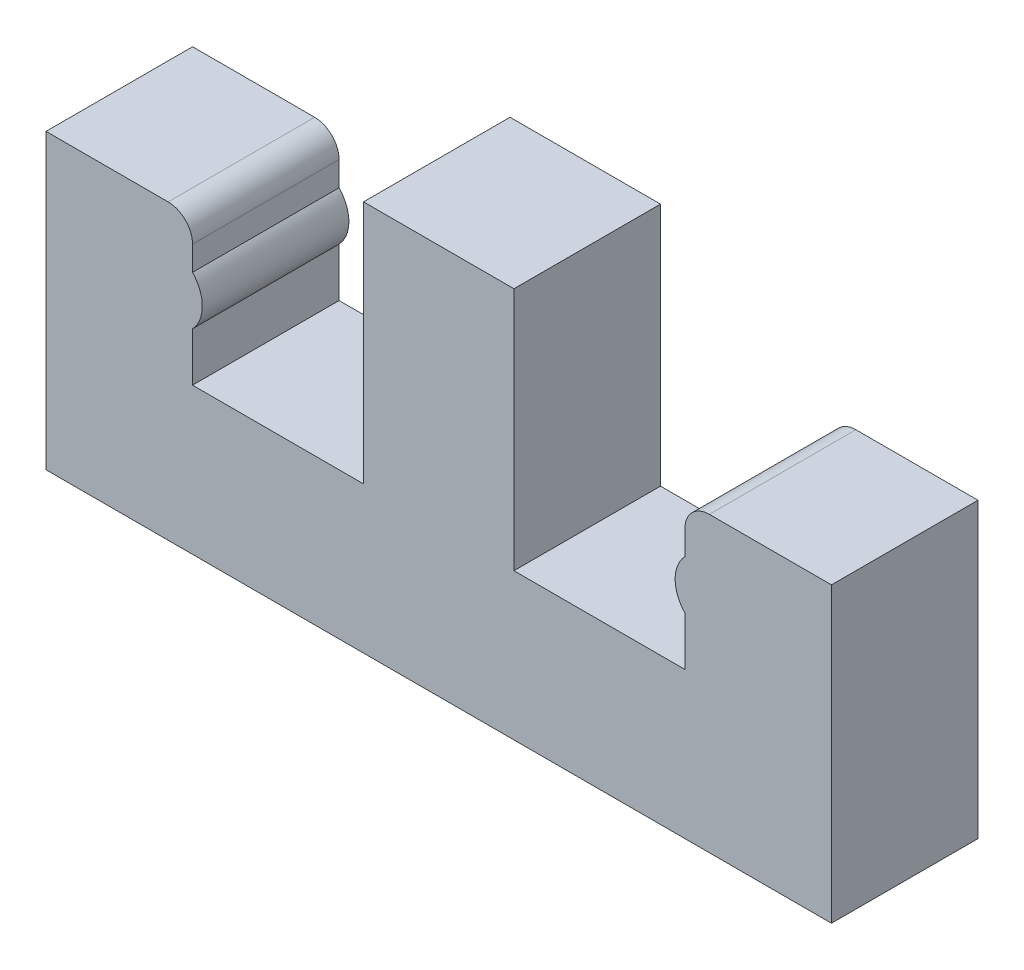
ISO-10303-21;
HEADER;
FILE_DESCRIPTION(('STEP AP214'),'2;1');
FILE_NAME('part.step','',(''),(''),'','','');
FILE_SCHEMA(('AUTOMOTIVE_DESIGN { 1 0 10303 214 1 1 1 1 }'));
ENDSEC;
DATA;
#1=APPLICATION_CONTEXT('core data for automotive mechanical design processes');
#2=APPLICATION_PROTOCOL_DEFINITION('international standard','automotive_design',2000,#1);
#3=PRODUCT_CONTEXT('',#1,'mechanical');
#4=PRODUCT('Part','Part','',(#3));
#5=PRODUCT_RELATED_PRODUCT_CATEGORY('part','',(#4));
#6=PRODUCT_DEFINITION_FORMATION('','',#4);
#7=PRODUCT_DEFINITION_CONTEXT('part definition',#1,'design');
#8=PRODUCT_DEFINITION('design','',#6,#7);
#9=PRODUCT_DEFINITION_SHAPE('','',#8);
#10=(LENGTH_UNIT() NAMED_UNIT(*) SI_UNIT(.MILLI.,.METRE.));
#11=(NAMED_UNIT(*) PLANE_ANGLE_UNIT() SI_UNIT($,.RADIAN.));
#12=(NAMED_UNIT(*) SI_UNIT($,.STERADIAN.) SOLID_ANGLE_UNIT());
#13=UNCERTAINTY_MEASURE_WITH_UNIT(LENGTH_MEASURE(1.E-05),#10,'distance_accuracy_value','');
#14=(GEOMETRIC_REPRESENTATION_CONTEXT(3) GLOBAL_UNCERTAINTY_ASSIGNED_CONTEXT((#13)) GLOBAL_UNIT_ASSIGNED_CONTEXT((#10,
#11,#12)) REPRESENTATION_CONTEXT('',''));
#15=CARTESIAN_POINT('',(0.,0.,0.));
#16=DIRECTION('',(0.,0.,1.));
#17=DIRECTION('',(1.,0.,0.));
#18=AXIS2_PLACEMENT_3D('',#15,#16,#17);
#19=CARTESIAN_POINT('',(-5.35043500893579,-2.26924572983576,3.));
#20=DIRECTION('',(1.,0.,0.));
#21=DIRECTION('',(0.,0.,-1.));
#22=AXIS2_PLACEMENT_3D('',#19,#20,#21);
#23=PLANE('',#22);
#24=DIRECTION('',(0.,-1.,0.));
#25=VECTOR('',#24,1.);
#26=CARTESIAN_POINT('',(-5.35043500893579,-2.26924572983576,0.));
#27=LINE('',#26,#25);
#28=CARTESIAN_POINT('',(-5.35043500893579,3.73075427016424,0.));
#29=VERTEX_POINT('',#28);
#30=CARTESIAN_POINT('',(-5.35043500893579,-2.26924572983576,0.));
#31=VERTEX_POINT('',#30);
#32=EDGE_CURVE('E181',#29,#31,#27,.T.);
#33=ORIENTED_EDGE('',*,*,#32,.T.);
#34=DIRECTION('',(0.,0.,-1.));
#35=VECTOR('',#34,1.);
#36=CARTESIAN_POINT('',(-5.35043500893579,-2.26924572983576,3.));
#37=LINE('',#36,#35);
#38=CARTESIAN_POINT('',(-5.35043500893579,-2.26924572983576,3.));
#39=VERTEX_POINT('',#38);
#40=EDGE_CURVE('E162',#39,#31,#37,.T.);
#41=ORIENTED_EDGE('',*,*,#40,.F.);
#42=DIRECTION('',(0.,-1.,0.));
#43=VECTOR('',#42,1.);
#44=CARTESIAN_POINT('',(-5.35043500893579,-2.26924572983576,3.));
#45=LINE('',#44,#43);
#46=CARTESIAN_POINT('',(-5.35043500893579,3.73075427016424,3.));
#47=VERTEX_POINT('',#46);
#48=EDGE_CURVE('E168',#47,#39,#45,.T.);
#49=ORIENTED_EDGE('',*,*,#48,.F.);
#50=DIRECTION('',(0.,0.,-1.));
#51=VECTOR('',#50,1.);
#52=CARTESIAN_POINT('',(-5.35043500893579,3.73075427016424,3.));
#53=LINE('',#52,#51);
#54=EDGE_CURVE('E242',#47,#29,#53,.T.);
#55=ORIENTED_EDGE('',*,*,#54,.T.);
#56=EDGE_LOOP('',(#33,#41,#49,#55));
#57=FACE_BOUND('',#56,.T.);
#58=ADVANCED_FACE('F33',(#57),#23,.F.);
#59=CARTESIAN_POINT('',(-5.35043500893579,-2.26924572983576,3.));
#60=DIRECTION('',(0.,1.,0.));
#61=DIRECTION('',(0.,0.,1.));
#62=AXIS2_PLACEMENT_3D('',#59,#60,#61);
#63=PLANE('',#62);
#64=DIRECTION('',(1.,0.,0.));
#65=VECTOR('',#64,1.);
#66=CARTESIAN_POINT('',(-5.35043500893579,-2.26924572983576,0.));
#67=LINE('',#66,#65);
#68=CARTESIAN_POINT('',(10.7295649910642,-2.26924572983576,0.));
#69=VERTEX_POINT('',#68);
#70=EDGE_CURVE('E278',#31,#69,#67,.T.);
#71=ORIENTED_EDGE('',*,*,#70,.T.);
#72=DIRECTION('',(0.,0.,-1.));
#73=VECTOR('',#72,1.);
#74=CARTESIAN_POINT('',(10.7295649910642,-2.26924572983576,3.));
#75=LINE('',#74,#73);
#76=CARTESIAN_POINT('',(10.7295649910642,-2.26924572983576,3.));
#77=VERTEX_POINT('',#76);
#78=EDGE_CURVE('E165',#77,#69,#75,.T.);
#79=ORIENTED_EDGE('',*,*,#78,.F.);
#80=DIRECTION('',(1.,0.,0.));
#81=VECTOR('',#80,1.);
#82=CARTESIAN_POINT('',(-5.35043500893579,-2.26924572983576,3.));
#83=LINE('',#82,#81);
#84=EDGE_CURVE('E158',#39,#77,#83,.T.);
#85=ORIENTED_EDGE('',*,*,#84,.F.);
#86=ORIENTED_EDGE('',*,*,#40,.T.);
#87=EDGE_LOOP('',(#71,#79,#85,#86));
#88=FACE_BOUND('',#87,.T.);
#89=ADVANCED_FACE('F160',(#88),#63,.F.);
#90=CARTESIAN_POINT('',(10.7295649910642,-2.26924572983576,3.));
#91=DIRECTION('',(-1.,0.,0.));
#92=DIRECTION('',(0.,-1.,0.));
#93=AXIS2_PLACEMENT_3D('',#90,#91,#92);
#94=PLANE('',#93);
#95=DIRECTION('',(0.,1.,0.));
#96=VECTOR('',#95,1.);
#97=CARTESIAN_POINT('',(10.7295649910642,-2.26924572983576,0.));
#98=LINE('',#97,#96);
#99=CARTESIAN_POINT('',(10.7295649910642,3.73075427016424,0.));
#100=VERTEX_POINT('',#99);
#101=EDGE_CURVE('E219',#69,#100,#98,.T.);
#102=ORIENTED_EDGE('',*,*,#101,.T.);
#103=DIRECTION('',(0.,0.,-1.));
#104=VECTOR('',#103,1.);
#105=CARTESIAN_POINT('',(10.7295649910642,3.73075427016424,3.));
#106=LINE('',#105,#104);
#107=CARTESIAN_POINT('',(10.7295649910642,3.73075427016424,3.));
#108=VERTEX_POINT('',#107);
#109=EDGE_CURVE('E187',#108,#100,#106,.T.);
#110=ORIENTED_EDGE('',*,*,#109,.F.);
#111=DIRECTION('',(0.,1.,0.));
#112=VECTOR('',#111,1.);
#113=CARTESIAN_POINT('',(10.7295649910642,-2.26924572983576,3.));
#114=LINE('',#113,#112);
#115=EDGE_CURVE('E167',#77,#108,#114,.T.);
#116=ORIENTED_EDGE('',*,*,#115,.F.);
#117=ORIENTED_EDGE('',*,*,#78,.T.);
#118=EDGE_LOOP('',(#102,#110,#116,#117));
#119=FACE_BOUND('',#118,.T.);
#120=ADVANCED_FACE('F305',(#119),#94,.F.);
#121=CARTESIAN_POINT('',(10.7295649910642,3.73075427016424,3.));
#122=DIRECTION('',(0.,-1.,0.));
#123=DIRECTION('',(0.,0.,-1.));
#124=AXIS2_PLACEMENT_3D('',#121,#122,#123);
#125=PLANE('',#124);
#126=DIRECTION('',(-1.,0.,0.));
#127=VECTOR('',#126,1.);
#128=CARTESIAN_POINT('',(10.7295649910642,3.73075427016424,0.));
#129=LINE('',#128,#127);
#130=CARTESIAN_POINT('',(8.22956499106421,3.73075427016424,0.));
#131=VERTEX_POINT('',#130);
#132=EDGE_CURVE('E215',#100,#131,#129,.T.);
#133=ORIENTED_EDGE('',*,*,#132,.T.);
#134=DIRECTION('',(0.,0.,-1.));
#135=VECTOR('',#134,1.);
#136=CARTESIAN_POINT('',(8.22956499106421,3.73075427016424,3.));
#137=LINE('',#136,#135);
#138=CARTESIAN_POINT('',(8.22956499106421,3.73075427016424,3.));
#139=VERTEX_POINT('',#138);
#140=EDGE_CURVE('E11',#131,#139,#137,.F.);
#141=ORIENTED_EDGE('',*,*,#140,.T.);
#142=DIRECTION('',(-1.,0.,0.));
#143=VECTOR('',#142,1.);
#144=CARTESIAN_POINT('',(10.7295649910642,3.73075427016424,3.));
#145=LINE('',#144,#143);
#146=EDGE_CURVE('E275',#108,#139,#145,.T.);
#147=ORIENTED_EDGE('',*,*,#146,.F.);
#148=ORIENTED_EDGE('',*,*,#109,.T.);
#149=EDGE_LOOP('',(#133,#141,#147,#148));
#150=FACE_BOUND('',#149,.T.);
#151=ADVANCED_FACE('F274',(#150),#125,.F.);
#152=CARTESIAN_POINT('',(7.72956499106421,2.73075427016424,3.));
#153=DIRECTION('',(1.,0.,0.));
#154=DIRECTION('',(0.,0.,-1.));
#155=AXIS2_PLACEMENT_3D('',#152,#153,#154);
#156=PLANE('',#155);
#157=DIRECTION('',(0.,-1.,0.));
#158=VECTOR('',#157,1.);
#159=CARTESIAN_POINT('',(7.72956499106421,2.73075427016424,3.));
#160=LINE('',#159,#158);
#161=CARTESIAN_POINT('',(7.72956499106421,3.23075427016424,3.));
#162=VERTEX_POINT('',#161);
#163=CARTESIAN_POINT('',(7.72956499106421,2.73075427016424,3.));
#164=VERTEX_POINT('',#163);
#165=EDGE_CURVE('E206',#162,#164,#160,.T.);
#166=ORIENTED_EDGE('',*,*,#165,.F.);
#167=DIRECTION('',(0.,0.,-1.));
#168=VECTOR('',#167,1.);
#169=CARTESIAN_POINT('',(7.72956499106421,3.23075427016424,3.));
#170=LINE('',#169,#168);
#171=CARTESIAN_POINT('',(7.72956499106421,3.23075427016424,0.));
#172=VERTEX_POINT('',#171);
#173=EDGE_CURVE('E41',#162,#172,#170,.T.);
#174=ORIENTED_EDGE('',*,*,#173,.T.);
#175=DIRECTION('',(0.,-1.,0.));
#176=VECTOR('',#175,1.);
#177=CARTESIAN_POINT('',(7.72956499106421,2.73075427016424,0.));
#178=LINE('',#177,#176);
#179=CARTESIAN_POINT('',(7.72956499106421,2.73075427016424,0.));
#180=VERTEX_POINT('',#179);
#181=EDGE_CURVE('E204',#172,#180,#178,.T.);
#182=ORIENTED_EDGE('',*,*,#181,.T.);
#183=DIRECTION('',(0.,0.,-1.));
#184=VECTOR('',#183,1.);
#185=CARTESIAN_POINT('',(7.72956499106421,2.73075427016424,3.));
#186=LINE('',#185,#184);
#187=EDGE_CURVE('E271',#164,#180,#186,.T.);
#188=ORIENTED_EDGE('',*,*,#187,.F.);
#189=EDGE_LOOP('',(#166,#174,#182,#188));
#190=FACE_BOUND('',#189,.T.);
#191=ADVANCED_FACE('F202',(#190),#156,.F.);
#192=CARTESIAN_POINT('',(8.25456499106421,2.23075427016424,3.));
#193=DIRECTION('',(0.,0.,-1.));
#194=DIRECTION('',(-1.,0.,0.));
#195=AXIS2_PLACEMENT_3D('',#192,#193,#194);
#196=CYLINDRICAL_SURFACE('',#195,0.725000000000002);
#197=CARTESIAN_POINT('',(8.25456499106421,2.23075427016424,0.));
#198=DIRECTION('',(0.,0.,1.));
#199=DIRECTION('',(1.,0.,0.));
#200=AXIS2_PLACEMENT_3D('',#197,#198,#199);
#201=CIRCLE('',#200,0.725000000000002);
#202=CARTESIAN_POINT('',(7.72956499106421,1.73075427016424,0.));
#203=VERTEX_POINT('',#202);
#204=EDGE_CURVE('E214',#180,#203,#201,.T.);
#205=ORIENTED_EDGE('',*,*,#204,.T.);
#206=DIRECTION('',(0.,0.,-1.));
#207=VECTOR('',#206,1.);
#208=CARTESIAN_POINT('',(7.72956499106421,1.73075427016424,3.));
#209=LINE('',#208,#207);
#210=CARTESIAN_POINT('',(7.72956499106421,1.73075427016424,3.));
#211=VERTEX_POINT('',#210);
#212=EDGE_CURVE('E268',#211,#203,#209,.T.);
#213=ORIENTED_EDGE('',*,*,#212,.F.);
#214=CARTESIAN_POINT('',(8.25456499106421,2.23075427016424,3.));
#215=DIRECTION('',(0.,0.,1.));
#216=DIRECTION('',(1.,0.,0.));
#217=AXIS2_PLACEMENT_3D('',#214,#215,#216);
#218=CIRCLE('',#217,0.725000000000002);
#219=EDGE_CURVE('E301',#164,#211,#218,.T.);
#220=ORIENTED_EDGE('',*,*,#219,.F.);
#221=ORIENTED_EDGE('',*,*,#187,.T.);
#222=EDGE_LOOP('',(#205,#213,#220,#221));
#223=FACE_BOUND('',#222,.T.);
#224=ADVANCED_FACE('F377',(#223),#196,.T.);
#225=CARTESIAN_POINT('',(7.72956499106421,1.73075427016424,3.));
#226=DIRECTION('',(1.,0.,0.));
#227=DIRECTION('',(0.,1.,0.));
#228=AXIS2_PLACEMENT_3D('',#225,#226,#227);
#229=PLANE('',#228);
#230=DIRECTION('',(0.,-1.,0.));
#231=VECTOR('',#230,1.);
#232=CARTESIAN_POINT('',(7.72956499106421,1.73075427016424,0.));
#233=LINE('',#232,#231);
#234=CARTESIAN_POINT('',(7.72956499106421,0.730754270164244,0.));
#235=VERTEX_POINT('',#234);
#236=EDGE_CURVE('E217',#203,#235,#233,.T.);
#237=ORIENTED_EDGE('',*,*,#236,.T.);
#238=DIRECTION('',(0.,0.,-1.));
#239=VECTOR('',#238,1.);
#240=CARTESIAN_POINT('',(7.72956499106421,0.730754270164244,3.));
#241=LINE('',#240,#239);
#242=CARTESIAN_POINT('',(7.72956499106421,0.730754270164244,3.));
#243=VERTEX_POINT('',#242);
#244=EDGE_CURVE('E265',#243,#235,#241,.T.);
#245=ORIENTED_EDGE('',*,*,#244,.F.);
#246=DIRECTION('',(0.,-1.,0.));
#247=VECTOR('',#246,1.);
#248=CARTESIAN_POINT('',(7.72956499106421,1.73075427016424,3.));
#249=LINE('',#248,#247);
#250=EDGE_CURVE('E299',#211,#243,#249,.T.);
#251=ORIENTED_EDGE('',*,*,#250,.F.);
#252=ORIENTED_EDGE('',*,*,#212,.T.);
#253=EDGE_LOOP('',(#237,#245,#251,#252));
#254=FACE_BOUND('',#253,.T.);
#255=ADVANCED_FACE('F372',(#254),#229,.F.);
#256=CARTESIAN_POINT('',(7.72956499106421,0.730754270164244,3.));
#257=DIRECTION('',(0.,-1.,0.));
#258=DIRECTION('',(1.,0.,0.));
#259=AXIS2_PLACEMENT_3D('',#256,#257,#258);
#260=PLANE('',#259);
#261=DIRECTION('',(-1.,0.,0.));
#262=VECTOR('',#261,1.);
#263=CARTESIAN_POINT('',(7.72956499106421,0.730754270164244,0.));
#264=LINE('',#263,#262);
#265=CARTESIAN_POINT('',(4.22956499106421,0.730754270164244,0.));
#266=VERTEX_POINT('',#265);
#267=EDGE_CURVE('E224',#235,#266,#264,.T.);
#268=ORIENTED_EDGE('',*,*,#267,.T.);
#269=DIRECTION('',(0.,0.,-1.));
#270=VECTOR('',#269,1.);
#271=CARTESIAN_POINT('',(4.22956499106421,0.730754270164244,3.));
#272=LINE('',#271,#270);
#273=CARTESIAN_POINT('',(4.22956499106421,0.730754270164244,3.));
#274=VERTEX_POINT('',#273);
#275=EDGE_CURVE('E262',#274,#266,#272,.T.);
#276=ORIENTED_EDGE('',*,*,#275,.F.);
#277=DIRECTION('',(-1.,0.,0.));
#278=VECTOR('',#277,1.);
#279=CARTESIAN_POINT('',(7.72956499106421,0.730754270164244,3.));
#280=LINE('',#279,#278);
#281=EDGE_CURVE('E297',#243,#274,#280,.T.);
#282=ORIENTED_EDGE('',*,*,#281,.F.);
#283=ORIENTED_EDGE('',*,*,#244,.T.);
#284=EDGE_LOOP('',(#268,#276,#282,#283));
#285=FACE_BOUND('',#284,.T.);
#286=ADVANCED_FACE('F369',(#285),#260,.F.);
#287=CARTESIAN_POINT('',(4.22956499106421,0.730754270164244,3.));
#288=DIRECTION('',(-1.,0.,0.));
#289=DIRECTION('',(0.,0.,1.));
#290=AXIS2_PLACEMENT_3D('',#287,#288,#289);
#291=PLANE('',#290);
#292=DIRECTION('',(0.,1.,0.));
#293=VECTOR('',#292,1.);
#294=CARTESIAN_POINT('',(4.22956499106421,0.730754270164244,0.));
#295=LINE('',#294,#293);
#296=CARTESIAN_POINT('',(4.22956499106421,5.73075427016424,0.));
#297=VERTEX_POINT('',#296);
#298=EDGE_CURVE('E226',#266,#297,#295,.T.);
#299=ORIENTED_EDGE('',*,*,#298,.T.);
#300=DIRECTION('',(0.,0.,-1.));
#301=VECTOR('',#300,1.);
#302=CARTESIAN_POINT('',(4.22956499106421,5.73075427016424,3.));
#303=LINE('',#302,#301);
#304=CARTESIAN_POINT('',(4.22956499106421,5.73075427016424,3.));
#305=VERTEX_POINT('',#304);
#306=EDGE_CURVE('E259',#305,#297,#303,.T.);
#307=ORIENTED_EDGE('',*,*,#306,.F.);
#308=DIRECTION('',(0.,1.,0.));
#309=VECTOR('',#308,1.);
#310=CARTESIAN_POINT('',(4.22956499106421,0.730754270164244,3.));
#311=LINE('',#310,#309);
#312=EDGE_CURVE('E295',#274,#305,#311,.T.);
#313=ORIENTED_EDGE('',*,*,#312,.F.);
#314=ORIENTED_EDGE('',*,*,#275,.T.);
#315=EDGE_LOOP('',(#299,#307,#313,#314));
#316=FACE_BOUND('',#315,.T.);
#317=ADVANCED_FACE('F365',(#316),#291,.F.);
#318=CARTESIAN_POINT('',(4.22956499106421,5.73075427016424,3.));
#319=DIRECTION('',(0.,-1.,0.));
#320=DIRECTION('',(1.,0.,0.));
#321=AXIS2_PLACEMENT_3D('',#318,#319,#320);
#322=PLANE('',#321);
#323=DIRECTION('',(-1.,0.,0.));
#324=VECTOR('',#323,1.);
#325=CARTESIAN_POINT('',(4.22956499106421,5.73075427016424,0.));
#326=LINE('',#325,#324);
#327=CARTESIAN_POINT('',(1.14956499106421,5.73075427016424,0.));
#328=VERTEX_POINT('',#327);
#329=EDGE_CURVE('E228',#297,#328,#326,.T.);
#330=ORIENTED_EDGE('',*,*,#329,.T.);
#331=DIRECTION('',(0.,0.,-1.));
#332=VECTOR('',#331,1.);
#333=CARTESIAN_POINT('',(1.14956499106421,5.73075427016424,3.));
#334=LINE('',#333,#332);
#335=CARTESIAN_POINT('',(1.14956499106421,5.73075427016424,3.));
#336=VERTEX_POINT('',#335);
#337=EDGE_CURVE('E256',#336,#328,#334,.T.);
#338=ORIENTED_EDGE('',*,*,#337,.F.);
#339=DIRECTION('',(-1.,0.,0.));
#340=VECTOR('',#339,1.);
#341=CARTESIAN_POINT('',(4.22956499106421,5.73075427016424,3.));
#342=LINE('',#341,#340);
#343=EDGE_CURVE('E293',#305,#336,#342,.T.);
#344=ORIENTED_EDGE('',*,*,#343,.F.);
#345=ORIENTED_EDGE('',*,*,#306,.T.);
#346=EDGE_LOOP('',(#330,#338,#344,#345));
#347=FACE_BOUND('',#346,.T.);
#348=ADVANCED_FACE('F360',(#347),#322,.F.);
#349=CARTESIAN_POINT('',(1.14956499106421,5.73075427016424,3.));
#350=DIRECTION('',(1.,0.,0.));
#351=DIRECTION('',(0.,1.,0.));
#352=AXIS2_PLACEMENT_3D('',#349,#350,#351);
#353=PLANE('',#352);
#354=DIRECTION('',(0.,-1.,0.));
#355=VECTOR('',#354,1.);
#356=CARTESIAN_POINT('',(1.14956499106421,5.73075427016424,0.));
#357=LINE('',#356,#355);
#358=CARTESIAN_POINT('',(1.14956499106421,0.730754270164243,0.));
#359=VERTEX_POINT('',#358);
#360=EDGE_CURVE('E230',#328,#359,#357,.T.);
#361=ORIENTED_EDGE('',*,*,#360,.T.);
#362=DIRECTION('',(0.,0.,-1.));
#363=VECTOR('',#362,1.);
#364=CARTESIAN_POINT('',(1.14956499106421,0.730754270164243,3.));
#365=LINE('',#364,#363);
#366=CARTESIAN_POINT('',(1.14956499106421,0.730754270164243,3.));
#367=VERTEX_POINT('',#366);
#368=EDGE_CURVE('E253',#367,#359,#365,.T.);
#369=ORIENTED_EDGE('',*,*,#368,.F.);
#370=DIRECTION('',(0.,-1.,0.));
#371=VECTOR('',#370,1.);
#372=CARTESIAN_POINT('',(1.14956499106421,5.73075427016424,3.));
#373=LINE('',#372,#371);
#374=EDGE_CURVE('E291',#336,#367,#373,.T.);
#375=ORIENTED_EDGE('',*,*,#374,.F.);
#376=ORIENTED_EDGE('',*,*,#337,.T.);
#377=EDGE_LOOP('',(#361,#369,#375,#376));
#378=FACE_BOUND('',#377,.T.);
#379=ADVANCED_FACE('F354',(#378),#353,.F.);
#380=CARTESIAN_POINT('',(1.14956499106421,0.730754270164243,3.));
#381=DIRECTION('',(0.,-1.,0.));
#382=DIRECTION('',(1.,0.,0.));
#383=AXIS2_PLACEMENT_3D('',#380,#381,#382);
#384=PLANE('',#383);
#385=DIRECTION('',(-1.,0.,0.));
#386=VECTOR('',#385,1.);
#387=CARTESIAN_POINT('',(1.14956499106421,0.730754270164243,0.));
#388=LINE('',#387,#386);
#389=CARTESIAN_POINT('',(-2.35043500893579,0.730754270164242,0.));
#390=VERTEX_POINT('',#389);
#391=EDGE_CURVE('E232',#359,#390,#388,.T.);
#392=ORIENTED_EDGE('',*,*,#391,.T.);
#393=DIRECTION('',(0.,0.,-1.));
#394=VECTOR('',#393,1.);
#395=CARTESIAN_POINT('',(-2.35043500893579,0.730754270164242,3.));
#396=LINE('',#395,#394);
#397=CARTESIAN_POINT('',(-2.35043500893579,0.730754270164242,3.));
#398=VERTEX_POINT('',#397);
#399=EDGE_CURVE('E250',#398,#390,#396,.T.);
#400=ORIENTED_EDGE('',*,*,#399,.F.);
#401=DIRECTION('',(-1.,0.,0.));
#402=VECTOR('',#401,1.);
#403=CARTESIAN_POINT('',(1.14956499106421,0.730754270164243,3.));
#404=LINE('',#403,#402);
#405=EDGE_CURVE('E289',#367,#398,#404,.T.);
#406=ORIENTED_EDGE('',*,*,#405,.F.);
#407=ORIENTED_EDGE('',*,*,#368,.T.);
#408=EDGE_LOOP('',(#392,#400,#406,#407));
#409=FACE_BOUND('',#408,.T.);
#410=ADVANCED_FACE('F350',(#409),#384,.F.);
#411=CARTESIAN_POINT('',(-2.35043500893579,1.73075427016424,3.));
#412=DIRECTION('',(-1.,0.,0.));
#413=DIRECTION('',(0.,0.,1.));
#414=AXIS2_PLACEMENT_3D('',#411,#412,#413);
#415=PLANE('',#414);
#416=DIRECTION('',(0.,1.,0.));
#417=VECTOR('',#416,1.);
#418=CARTESIAN_POINT('',(-2.35043500893579,1.73075427016424,0.));
#419=LINE('',#418,#417);
#420=CARTESIAN_POINT('',(-2.35043500893579,1.73075427016424,0.));
#421=VERTEX_POINT('',#420);
#422=EDGE_CURVE('E234',#390,#421,#419,.T.);
#423=ORIENTED_EDGE('',*,*,#422,.T.);
#424=DIRECTION('',(0.,0.,-1.));
#425=VECTOR('',#424,1.);
#426=CARTESIAN_POINT('',(-2.35043500893579,1.73075427016424,3.));
#427=LINE('',#426,#425);
#428=CARTESIAN_POINT('',(-2.35043500893579,1.73075427016424,3.));
#429=VERTEX_POINT('',#428);
#430=EDGE_CURVE('E247',#429,#421,#427,.T.);
#431=ORIENTED_EDGE('',*,*,#430,.F.);
#432=DIRECTION('',(0.,1.,0.));
#433=VECTOR('',#432,1.);
#434=CARTESIAN_POINT('',(-2.35043500893579,1.73075427016424,3.));
#435=LINE('',#434,#433);
#436=EDGE_CURVE('E287',#398,#429,#435,.T.);
#437=ORIENTED_EDGE('',*,*,#436,.F.);
#438=ORIENTED_EDGE('',*,*,#399,.T.);
#439=EDGE_LOOP('',(#423,#431,#437,#438));
#440=FACE_BOUND('',#439,.T.);
#441=ADVANCED_FACE('F345',(#440),#415,.F.);
#442=CARTESIAN_POINT('',(-2.87543500893579,2.23075427016424,3.));
#443=DIRECTION('',(0.,0.,-1.));
#444=DIRECTION('',(-1.,0.,0.));
#445=AXIS2_PLACEMENT_3D('',#442,#443,#444);
#446=CYLINDRICAL_SURFACE('',#445,0.725);
#447=CARTESIAN_POINT('',(-2.87543500893579,2.23075427016424,0.));
#448=DIRECTION('',(0.,0.,1.));
#449=DIRECTION('',(-1.,0.,0.));
#450=AXIS2_PLACEMENT_3D('',#447,#448,#449);
#451=CIRCLE('',#450,0.725);
#452=CARTESIAN_POINT('',(-2.35043500893579,2.73075427016424,0.));
#453=VERTEX_POINT('',#452);
#454=EDGE_CURVE('E236',#421,#453,#451,.T.);
#455=ORIENTED_EDGE('',*,*,#454,.T.);
#456=DIRECTION('',(0.,0.,-1.));
#457=VECTOR('',#456,1.);
#458=CARTESIAN_POINT('',(-2.35043500893579,2.73075427016424,3.));
#459=LINE('',#458,#457);
#460=CARTESIAN_POINT('',(-2.35043500893579,2.73075427016424,3.));
#461=VERTEX_POINT('',#460);
#462=EDGE_CURVE('E244',#461,#453,#459,.T.);
#463=ORIENTED_EDGE('',*,*,#462,.F.);
#464=CARTESIAN_POINT('',(-2.87543500893579,2.23075427016424,3.));
#465=DIRECTION('',(0.,0.,1.));
#466=DIRECTION('',(-1.,0.,0.));
#467=AXIS2_PLACEMENT_3D('',#464,#465,#466);
#468=CIRCLE('',#467,0.725);
#469=EDGE_CURVE('E285',#429,#461,#468,.T.);
#470=ORIENTED_EDGE('',*,*,#469,.F.);
#471=ORIENTED_EDGE('',*,*,#430,.T.);
#472=EDGE_LOOP('',(#455,#463,#470,#471));
#473=FACE_BOUND('',#472,.T.);
#474=ADVANCED_FACE('F339',(#473),#446,.T.);
#475=CARTESIAN_POINT('',(-2.35043500893579,2.73075427016424,3.));
#476=DIRECTION('',(-1.,0.,0.));
#477=DIRECTION('',(0.,0.,1.));
#478=AXIS2_PLACEMENT_3D('',#475,#476,#477);
#479=PLANE('',#478);
#480=DIRECTION('',(0.,1.,0.));
#481=VECTOR('',#480,1.);
#482=CARTESIAN_POINT('',(-2.35043500893579,2.73075427016424,0.));
#483=LINE('',#482,#481);
#484=CARTESIAN_POINT('',(-2.35043500893579,3.23075427016424,0.));
#485=VERTEX_POINT('',#484);
#486=EDGE_CURVE('E238',#453,#485,#483,.T.);
#487=ORIENTED_EDGE('',*,*,#486,.T.);
#488=DIRECTION('',(0.,0.,-1.));
#489=VECTOR('',#488,1.);
#490=CARTESIAN_POINT('',(-2.35043500893579,3.23075427016424,3.));
#491=LINE('',#490,#489);
#492=CARTESIAN_POINT('',(-2.35043500893579,3.23075427016424,3.));
#493=VERTEX_POINT('',#492);
#494=EDGE_CURVE('E194',#485,#493,#491,.F.);
#495=ORIENTED_EDGE('',*,*,#494,.T.);
#496=DIRECTION('',(0.,1.,0.));
#497=VECTOR('',#496,1.);
#498=CARTESIAN_POINT('',(-2.35043500893579,2.73075427016424,3.));
#499=LINE('',#498,#497);
#500=EDGE_CURVE('E283',#461,#493,#499,.T.);
#501=ORIENTED_EDGE('',*,*,#500,.F.);
#502=ORIENTED_EDGE('',*,*,#462,.T.);
#503=EDGE_LOOP('',(#487,#495,#501,#502));
#504=FACE_BOUND('',#503,.T.);
#505=ADVANCED_FACE('F335',(#504),#479,.F.);
#506=CARTESIAN_POINT('',(-5.35043500893579,3.73075427016424,3.));
#507=DIRECTION('',(0.,-1.,0.));
#508=DIRECTION('',(0.,0.,-1.));
#509=AXIS2_PLACEMENT_3D('',#506,#507,#508);
#510=PLANE('',#509);
#511=DIRECTION('',(-1.,0.,0.));
#512=VECTOR('',#511,1.);
#513=CARTESIAN_POINT('',(-5.35043500893579,3.73075427016424,3.));
#514=LINE('',#513,#512);
#515=CARTESIAN_POINT('',(-2.85043500893579,3.73075427016424,3.));
#516=VERTEX_POINT('',#515);
#517=EDGE_CURVE('E174',#516,#47,#514,.T.);
#518=ORIENTED_EDGE('',*,*,#517,.F.);
#519=DIRECTION('',(0.,0.,-1.));
#520=VECTOR('',#519,1.);
#521=CARTESIAN_POINT('',(-2.85043500893579,3.73075427016424,3.));
#522=LINE('',#521,#520);
#523=CARTESIAN_POINT('',(-2.85043500893579,3.73075427016424,0.));
#524=VERTEX_POINT('',#523);
#525=EDGE_CURVE('E182',#516,#524,#522,.T.);
#526=ORIENTED_EDGE('',*,*,#525,.T.);
#527=DIRECTION('',(-1.,0.,0.));
#528=VECTOR('',#527,1.);
#529=CARTESIAN_POINT('',(-5.35043500893579,3.73075427016424,0.));
#530=LINE('',#529,#528);
#531=EDGE_CURVE('E178',#524,#29,#530,.T.);
#532=ORIENTED_EDGE('',*,*,#531,.T.);
#533=ORIENTED_EDGE('',*,*,#54,.F.);
#534=EDGE_LOOP('',(#518,#526,#532,#533));
#535=FACE_BOUND('',#534,.T.);
#536=ADVANCED_FACE('F331',(#535),#510,.F.);
#537=CARTESIAN_POINT('',(-2.87543500893579,2.23075427016424,3.));
#538=DIRECTION('',(0.,0.,-1.));
#539=DIRECTION('',(-1.,0.,0.));
#540=AXIS2_PLACEMENT_3D('',#537,#538,#539);
#541=PLANE('',#540);
#542=ORIENTED_EDGE('',*,*,#500,.T.);
#543=CARTESIAN_POINT('',(-2.85043500893579,3.23075427016424,3.));
#544=DIRECTION('',(0.,0.,-1.));
#545=DIRECTION('',(-1.,0.,0.));
#546=AXIS2_PLACEMENT_3D('',#543,#544,#545);
#547=CIRCLE('',#546,0.5);
#548=EDGE_CURVE('E197',#493,#516,#547,.F.);
#549=ORIENTED_EDGE('',*,*,#548,.T.);
#550=ORIENTED_EDGE('',*,*,#517,.T.);
#551=ORIENTED_EDGE('',*,*,#48,.T.);
#552=ORIENTED_EDGE('',*,*,#84,.T.);
#553=ORIENTED_EDGE('',*,*,#115,.T.);
#554=ORIENTED_EDGE('',*,*,#146,.T.);
#555=CARTESIAN_POINT('',(8.22956499106421,3.23075427016424,3.));
#556=DIRECTION('',(0.,0.,-1.));
#557=DIRECTION('',(-1.,0.,0.));
#558=AXIS2_PLACEMENT_3D('',#555,#556,#557);
#559=CIRCLE('',#558,0.5);
#560=EDGE_CURVE('E48',#139,#162,#559,.F.);
#561=ORIENTED_EDGE('',*,*,#560,.T.);
#562=ORIENTED_EDGE('',*,*,#165,.T.);
#563=ORIENTED_EDGE('',*,*,#219,.T.);
#564=ORIENTED_EDGE('',*,*,#250,.T.);
#565=ORIENTED_EDGE('',*,*,#281,.T.);
#566=ORIENTED_EDGE('',*,*,#312,.T.);
#567=ORIENTED_EDGE('',*,*,#343,.T.);
#568=ORIENTED_EDGE('',*,*,#374,.T.);
#569=ORIENTED_EDGE('',*,*,#405,.T.);
#570=ORIENTED_EDGE('',*,*,#436,.T.);
#571=ORIENTED_EDGE('',*,*,#469,.T.);
#572=EDGE_LOOP('',(#542,#549,#550,#551,#552,#553,#554,#561,#562,#563,#564,#565,#566,#567,#568,
#569,#570,#571));
#573=FACE_BOUND('',#572,.T.);
#574=ADVANCED_FACE('F172',(#573),#541,.F.);
#575=CARTESIAN_POINT('',(-2.87543500893579,2.23075427016424,0.));
#576=DIRECTION('',(0.,0.,-1.));
#577=DIRECTION('',(-1.,0.,0.));
#578=AXIS2_PLACEMENT_3D('',#575,#576,#577);
#579=PLANE('',#578);
#580=ORIENTED_EDGE('',*,*,#531,.F.);
#581=CARTESIAN_POINT('',(-2.85043500893579,3.23075427016424,0.));
#582=DIRECTION('',(0.,0.,-1.));
#583=DIRECTION('',(-1.,0.,0.));
#584=AXIS2_PLACEMENT_3D('',#581,#582,#583);
#585=CIRCLE('',#584,0.5);
#586=EDGE_CURVE('E192',#524,#485,#585,.T.);
#587=ORIENTED_EDGE('',*,*,#586,.T.);
#588=ORIENTED_EDGE('',*,*,#486,.F.);
#589=ORIENTED_EDGE('',*,*,#454,.F.);
#590=ORIENTED_EDGE('',*,*,#422,.F.);
#591=ORIENTED_EDGE('',*,*,#391,.F.);
#592=ORIENTED_EDGE('',*,*,#360,.F.);
#593=ORIENTED_EDGE('',*,*,#329,.F.);
#594=ORIENTED_EDGE('',*,*,#298,.F.);
#595=ORIENTED_EDGE('',*,*,#267,.F.);
#596=ORIENTED_EDGE('',*,*,#236,.F.);
#597=ORIENTED_EDGE('',*,*,#204,.F.);
#598=ORIENTED_EDGE('',*,*,#181,.F.);
#599=CARTESIAN_POINT('',(8.22956499106421,3.23075427016424,0.));
#600=DIRECTION('',(0.,0.,-1.));
#601=DIRECTION('',(-1.,0.,0.));
#602=AXIS2_PLACEMENT_3D('',#599,#600,#601);
#603=CIRCLE('',#602,0.5);
#604=EDGE_CURVE('E185',#172,#131,#603,.T.);
#605=ORIENTED_EDGE('',*,*,#604,.T.);
#606=ORIENTED_EDGE('',*,*,#132,.F.);
#607=ORIENTED_EDGE('',*,*,#101,.F.);
#608=ORIENTED_EDGE('',*,*,#70,.F.);
#609=ORIENTED_EDGE('',*,*,#32,.F.);
#610=EDGE_LOOP('',(#580,#587,#588,#589,#590,#591,#592,#593,#594,#595,#596,#597,#598,#605,#606,
#607,#608,#609));
#611=FACE_BOUND('',#610,.T.);
#612=ADVANCED_FACE('F211',(#611),#579,.T.);
#613=CARTESIAN_POINT('',(-2.85043500893579,3.23075427016424,3.));
#614=DIRECTION('',(0.,0.,-1.));
#615=DIRECTION('',(-1.,0.,0.));
#616=AXIS2_PLACEMENT_3D('',#613,#614,#615);
#617=CYLINDRICAL_SURFACE('',#616,0.5);
#618=ORIENTED_EDGE('',*,*,#548,.F.);
#619=ORIENTED_EDGE('',*,*,#494,.F.);
#620=ORIENTED_EDGE('',*,*,#586,.F.);
#621=ORIENTED_EDGE('',*,*,#525,.F.);
#622=EDGE_LOOP('',(#618,#619,#620,#621));
#623=FACE_BOUND('',#622,.T.);
#624=ADVANCED_FACE('F318',(#623),#617,.T.);
#625=CARTESIAN_POINT('',(8.22956499106421,3.23075427016424,3.));
#626=DIRECTION('',(0.,0.,-1.));
#627=DIRECTION('',(-1.,0.,0.));
#628=AXIS2_PLACEMENT_3D('',#625,#626,#627);
#629=CYLINDRICAL_SURFACE('',#628,0.5);
#630=ORIENTED_EDGE('',*,*,#560,.F.);
#631=ORIENTED_EDGE('',*,*,#140,.F.);
#632=ORIENTED_EDGE('',*,*,#604,.F.);
#633=ORIENTED_EDGE('',*,*,#173,.F.);
#634=EDGE_LOOP('',(#630,#631,#632,#633));
#635=FACE_BOUND('',#634,.T.);
#636=ADVANCED_FACE('F35',(#635),#629,.T.);
#637=CLOSED_SHELL('',(#58,#89,#120,#151,#191,#224,#255,#286,#317,#348,#379,#410,#441,#474,#505,
#536,#574,#612,#624,#636));
#638=MANIFOLD_SOLID_BREP('B2',#637);
#639=ADVANCED_BREP_SHAPE_REPRESENTATION('',(#18,#638),#14);
#640=SHAPE_DEFINITION_REPRESENTATION(#9,#639);
ENDSEC;
END-ISO-10303-21;
